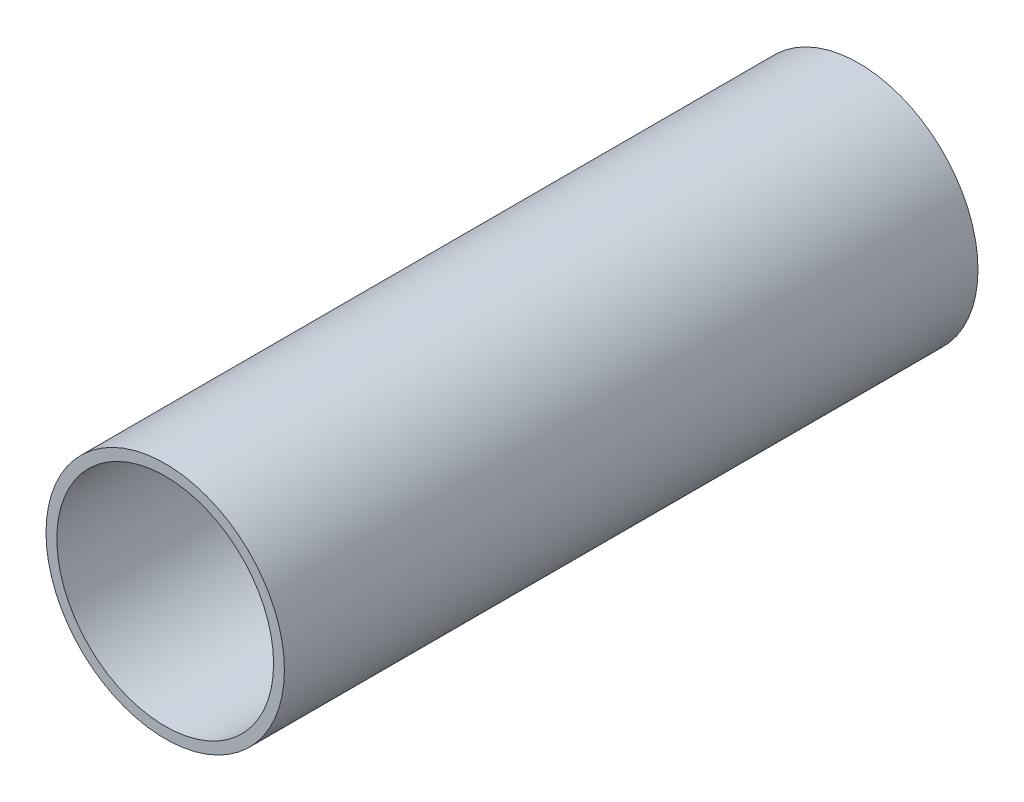
ISO-10303-21;
HEADER;
FILE_DESCRIPTION(('STEP AP214'),'2;1');
FILE_NAME('part.step','',(''),(''),'','','');
FILE_SCHEMA(('AUTOMOTIVE_DESIGN { 1 0 10303 214 1 1 1 1 }'));
ENDSEC;
DATA;
#1=APPLICATION_CONTEXT('core data for automotive mechanical design processes');
#2=APPLICATION_PROTOCOL_DEFINITION('international standard','automotive_design',2000,#1);
#3=PRODUCT_CONTEXT('',#1,'mechanical');
#4=PRODUCT('Part','Part','',(#3));
#5=PRODUCT_RELATED_PRODUCT_CATEGORY('part','',(#4));
#6=PRODUCT_DEFINITION_FORMATION('','',#4);
#7=PRODUCT_DEFINITION_CONTEXT('part definition',#1,'design');
#8=PRODUCT_DEFINITION('design','',#6,#7);
#9=PRODUCT_DEFINITION_SHAPE('','',#8);
#10=(LENGTH_UNIT() NAMED_UNIT(*) SI_UNIT(.MILLI.,.METRE.));
#11=(NAMED_UNIT(*) PLANE_ANGLE_UNIT() SI_UNIT($,.RADIAN.));
#12=(NAMED_UNIT(*) SI_UNIT($,.STERADIAN.) SOLID_ANGLE_UNIT());
#13=UNCERTAINTY_MEASURE_WITH_UNIT(LENGTH_MEASURE(1.E-05),#10,'distance_accuracy_value','');
#14=(GEOMETRIC_REPRESENTATION_CONTEXT(3) GLOBAL_UNCERTAINTY_ASSIGNED_CONTEXT((#13)) GLOBAL_UNIT_ASSIGNED_CONTEXT((#10,
#11,#12)) REPRESENTATION_CONTEXT('',''));
#15=CARTESIAN_POINT('',(0.,0.,0.));
#16=DIRECTION('',(0.,0.,1.));
#17=DIRECTION('',(1.,0.,0.));
#18=AXIS2_PLACEMENT_3D('',#15,#16,#17);
#19=CARTESIAN_POINT('',(0.,0.,101.6));
#20=DIRECTION('',(0.,0.,1.));
#21=DIRECTION('',(1.,0.,0.));
#22=AXIS2_PLACEMENT_3D('',#19,#20,#21);
#23=PLANE('',#22);
#24=CARTESIAN_POINT('',(0.,0.,101.6));
#25=DIRECTION('',(0.,0.,1.));
#26=DIRECTION('',(1.,0.,0.));
#27=AXIS2_PLACEMENT_3D('',#24,#25,#26);
#28=CIRCLE('',#27,17.4625);
#29=CARTESIAN_POINT('',(17.4625,0.,101.6));
#30=VERTEX_POINT('',#29);
#31=EDGE_CURVE('E10',#30,#30,#28,.T.);
#32=ORIENTED_EDGE('',*,*,#31,.T.);
#33=EDGE_LOOP('',(#32));
#34=FACE_BOUND('',#33,.T.);
#35=CARTESIAN_POINT('',(0.,0.,101.6));
#36=DIRECTION('',(0.,0.,1.));
#37=DIRECTION('',(1.,0.,0.));
#38=AXIS2_PLACEMENT_3D('',#35,#36,#37);
#39=CIRCLE('',#38,15.875);
#40=CARTESIAN_POINT('',(15.875,0.,101.6));
#41=VERTEX_POINT('',#40);
#42=EDGE_CURVE('E45',#41,#41,#39,.T.);
#43=ORIENTED_EDGE('',*,*,#42,.F.);
#44=EDGE_LOOP('',(#43));
#45=FACE_BOUND('',#44,.T.);
#46=ADVANCED_FACE('F34',(#34,#45),#23,.T.);
#47=CARTESIAN_POINT('',(0.,0.,0.));
#48=DIRECTION('',(0.,0.,1.));
#49=DIRECTION('',(1.,0.,0.));
#50=AXIS2_PLACEMENT_3D('',#47,#48,#49);
#51=PLANE('',#50);
#52=CARTESIAN_POINT('',(0.,0.,0.));
#53=DIRECTION('',(0.,0.,1.));
#54=DIRECTION('',(1.,0.,0.));
#55=AXIS2_PLACEMENT_3D('',#52,#53,#54);
#56=CIRCLE('',#55,17.4625);
#57=CARTESIAN_POINT('',(17.4625,0.,0.));
#58=VERTEX_POINT('',#57);
#59=EDGE_CURVE('E38',#58,#58,#56,.T.);
#60=ORIENTED_EDGE('',*,*,#59,.F.);
#61=EDGE_LOOP('',(#60));
#62=FACE_BOUND('',#61,.T.);
#63=CARTESIAN_POINT('',(0.,0.,0.));
#64=DIRECTION('',(0.,0.,1.));
#65=DIRECTION('',(1.,0.,0.));
#66=AXIS2_PLACEMENT_3D('',#63,#64,#65);
#67=CIRCLE('',#66,15.875);
#68=CARTESIAN_POINT('',(15.875,0.,0.));
#69=VERTEX_POINT('',#68);
#70=EDGE_CURVE('E47',#69,#69,#67,.T.);
#71=ORIENTED_EDGE('',*,*,#70,.T.);
#72=EDGE_LOOP('',(#71));
#73=FACE_BOUND('',#72,.T.);
#74=ADVANCED_FACE('F57',(#62,#73),#51,.F.);
#75=CARTESIAN_POINT('',(0.,0.,101.6));
#76=DIRECTION('',(0.,0.,-1.));
#77=DIRECTION('',(-1.,0.,0.));
#78=AXIS2_PLACEMENT_3D('',#75,#76,#77);
#79=CYLINDRICAL_SURFACE('',#78,17.4625);
#80=ORIENTED_EDGE('',*,*,#31,.F.);
#81=EDGE_LOOP('',(#80));
#82=FACE_BOUND('',#81,.T.);
#83=ORIENTED_EDGE('',*,*,#59,.T.);
#84=EDGE_LOOP('',(#83));
#85=FACE_BOUND('',#84,.T.);
#86=ADVANCED_FACE('F36',(#82,#85),#79,.T.);
#87=CARTESIAN_POINT('',(0.,0.,101.6));
#88=DIRECTION('',(0.,0.,-1.));
#89=DIRECTION('',(-1.,0.,0.));
#90=AXIS2_PLACEMENT_3D('',#87,#88,#89);
#91=CYLINDRICAL_SURFACE('',#90,15.875);
#92=ORIENTED_EDGE('',*,*,#42,.T.);
#93=EDGE_LOOP('',(#92));
#94=FACE_BOUND('',#93,.T.);
#95=ORIENTED_EDGE('',*,*,#70,.F.);
#96=EDGE_LOOP('',(#95));
#97=FACE_BOUND('',#96,.T.);
#98=ADVANCED_FACE('F53',(#94,#97),#91,.F.);
#99=CLOSED_SHELL('',(#46,#74,#86,#98));
#100=MANIFOLD_SOLID_BREP('B2',#99);
#101=ADVANCED_BREP_SHAPE_REPRESENTATION('',(#18,#100),#14);
#102=SHAPE_DEFINITION_REPRESENTATION(#9,#101);
ENDSEC;
END-ISO-10303-21;
